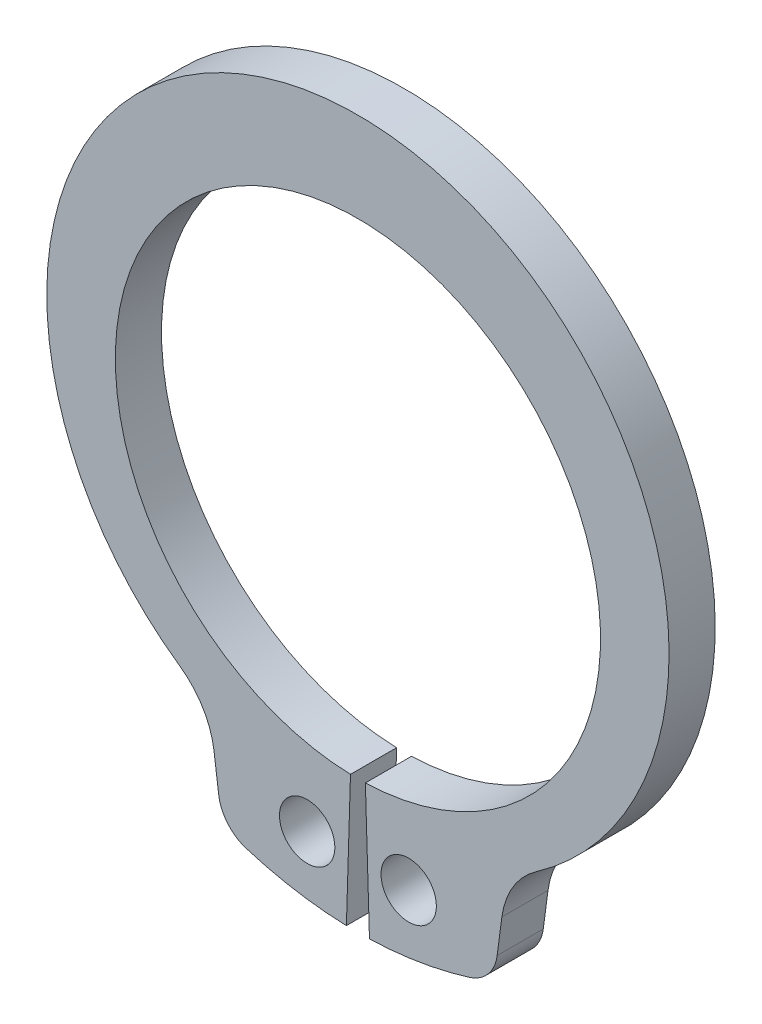
ISO-10303-21;
HEADER;
FILE_DESCRIPTION(('STEP AP214'),'2;1');
FILE_NAME('part.step','',(''),(''),'','','');
FILE_SCHEMA(('AUTOMOTIVE_DESIGN { 1 0 10303 214 1 1 1 1 }'));
ENDSEC;
DATA;
#1=APPLICATION_CONTEXT('core data for automotive mechanical design processes');
#2=APPLICATION_PROTOCOL_DEFINITION('international standard','automotive_design',2000,#1);
#3=PRODUCT_CONTEXT('',#1,'mechanical');
#4=PRODUCT('Part','Part','',(#3));
#5=PRODUCT_RELATED_PRODUCT_CATEGORY('part','',(#4));
#6=PRODUCT_DEFINITION_FORMATION('','',#4);
#7=PRODUCT_DEFINITION_CONTEXT('part definition',#1,'design');
#8=PRODUCT_DEFINITION('design','',#6,#7);
#9=PRODUCT_DEFINITION_SHAPE('','',#8);
#10=(LENGTH_UNIT() NAMED_UNIT(*) SI_UNIT(.MILLI.,.METRE.));
#11=(NAMED_UNIT(*) PLANE_ANGLE_UNIT() SI_UNIT($,.RADIAN.));
#12=(NAMED_UNIT(*) SI_UNIT($,.STERADIAN.) SOLID_ANGLE_UNIT());
#13=UNCERTAINTY_MEASURE_WITH_UNIT(LENGTH_MEASURE(1.E-05),#10,'distance_accuracy_value','');
#14=(GEOMETRIC_REPRESENTATION_CONTEXT(3) GLOBAL_UNCERTAINTY_ASSIGNED_CONTEXT((#13)) GLOBAL_UNIT_ASSIGNED_CONTEXT((#10,
#11,#12)) REPRESENTATION_CONTEXT('',''));
#15=CARTESIAN_POINT('',(0.,0.,0.));
#16=DIRECTION('',(0.,0.,1.));
#17=DIRECTION('',(1.,0.,0.));
#18=AXIS2_PLACEMENT_3D('',#15,#16,#17);
#19=CARTESIAN_POINT('',(0.,0.,-0.889));
#20=DIRECTION('',(0.,0.,1.));
#21=DIRECTION('',(1.,0.,0.));
#22=AXIS2_PLACEMENT_3D('',#19,#20,#21);
#23=CYLINDRICAL_SURFACE('',#22,4.6736);
#24=CARTESIAN_POINT('',(0.,0.,0.));
#25=DIRECTION('',(0.,0.,-1.));
#26=DIRECTION('',(1.,0.,0.));
#27=AXIS2_PLACEMENT_3D('',#24,#25,#26);
#28=CIRCLE('',#27,4.6736);
#29=CARTESIAN_POINT('',(-0.143487719298246,-4.67139681834145,0.));
#30=VERTEX_POINT('',#29);
#31=CARTESIAN_POINT('',(0.143487719298246,-4.67139681834145,0.));
#32=VERTEX_POINT('',#31);
#33=EDGE_CURVE('E153',#30,#32,#28,.T.);
#34=ORIENTED_EDGE('',*,*,#33,.F.);
#35=DIRECTION('',(0.,0.,1.));
#36=VECTOR('',#35,1.);
#37=CARTESIAN_POINT('',(-0.143487719298246,-4.67139681834145,-0.889));
#38=LINE('',#37,#36);
#39=CARTESIAN_POINT('',(-0.143487719298246,-4.67139681834145,-0.889));
#40=VERTEX_POINT('',#39);
#41=EDGE_CURVE('E11',#40,#30,#38,.T.);
#42=ORIENTED_EDGE('',*,*,#41,.F.);
#43=CARTESIAN_POINT('',(0.,0.,-0.889));
#44=DIRECTION('',(0.,0.,-1.));
#45=DIRECTION('',(1.,0.,0.));
#46=AXIS2_PLACEMENT_3D('',#43,#44,#45);
#47=CIRCLE('',#46,4.6736);
#48=CARTESIAN_POINT('',(0.143487719298246,-4.67139681834145,-0.889));
#49=VERTEX_POINT('',#48);
#50=EDGE_CURVE('E186',#40,#49,#47,.T.);
#51=ORIENTED_EDGE('',*,*,#50,.T.);
#52=DIRECTION('',(0.,0.,1.));
#53=VECTOR('',#52,1.);
#54=CARTESIAN_POINT('',(0.143487719298246,-4.67139681834145,-0.889));
#55=LINE('',#54,#53);
#56=EDGE_CURVE('E35',#49,#32,#55,.T.);
#57=ORIENTED_EDGE('',*,*,#56,.T.);
#58=EDGE_LOOP('',(#34,#42,#51,#57));
#59=FACE_BOUND('',#58,.T.);
#60=ADVANCED_FACE('F32',(#59),#23,.F.);
#61=CARTESIAN_POINT('',(-0.143487719298246,-4.67139681834145,-0.889));
#62=DIRECTION('',(0.99952859002513,-0.0307017543859649,0.));
#63=DIRECTION('',(0.0307017543859649,0.99952859002513,0.));
#64=AXIS2_PLACEMENT_3D('',#61,#62,#63);
#65=PLANE('',#64);
#66=DIRECTION('',(0.0307017543859649,0.99952859002513,0.));
#67=VECTOR('',#66,1.);
#68=CARTESIAN_POINT('',(-0.143487719298246,-4.67139681834145,0.));
#69=LINE('',#68,#67);
#70=CARTESIAN_POINT('',(-0.22225,-7.23558746319192,0.));
#71=VERTEX_POINT('',#70);
#72=EDGE_CURVE('E184',#71,#30,#69,.T.);
#73=ORIENTED_EDGE('',*,*,#72,.F.);
#74=DIRECTION('',(0.,0.,1.));
#75=VECTOR('',#74,1.);
#76=CARTESIAN_POINT('',(-0.22225,-7.23558746319192,-0.889));
#77=LINE('',#76,#75);
#78=CARTESIAN_POINT('',(-0.22225,-7.23558746319192,-0.889));
#79=VERTEX_POINT('',#78);
#80=EDGE_CURVE('E41',#79,#71,#77,.T.);
#81=ORIENTED_EDGE('',*,*,#80,.F.);
#82=DIRECTION('',(0.0307017543859649,0.99952859002513,0.));
#83=VECTOR('',#82,1.);
#84=CARTESIAN_POINT('',(-0.143487719298246,-4.67139681834145,-0.889));
#85=LINE('',#84,#83);
#86=EDGE_CURVE('E143',#79,#40,#85,.T.);
#87=ORIENTED_EDGE('',*,*,#86,.T.);
#88=ORIENTED_EDGE('',*,*,#41,.T.);
#89=EDGE_LOOP('',(#73,#81,#87,#88));
#90=FACE_BOUND('',#89,.T.);
#91=ADVANCED_FACE('F206',(#90),#65,.T.);
#92=CARTESIAN_POINT('',(0.,0.,-0.889));
#93=DIRECTION('',(0.,0.,1.));
#94=DIRECTION('',(1.,0.,0.));
#95=AXIS2_PLACEMENT_3D('',#92,#93,#94);
#96=CYLINDRICAL_SURFACE('',#95,7.239);
#97=CARTESIAN_POINT('',(0.,0.,0.));
#98=DIRECTION('',(0.,0.,1.));
#99=DIRECTION('',(1.,0.,0.));
#100=AXIS2_PLACEMENT_3D('',#97,#98,#99);
#101=CIRCLE('',#100,7.239);
#102=CARTESIAN_POINT('',(-2.15332023130108,-6.91131919256154,0.));
#103=VERTEX_POINT('',#102);
#104=EDGE_CURVE('E130',#103,#71,#101,.T.);
#105=ORIENTED_EDGE('',*,*,#104,.F.);
#106=DIRECTION('',(0.,0.,1.));
#107=VECTOR('',#106,1.);
#108=CARTESIAN_POINT('',(-2.15332023130108,-6.91131919256154,-0.889));
#109=LINE('',#108,#107);
#110=CARTESIAN_POINT('',(-2.15332023130108,-6.91131919256154,-0.889));
#111=VERTEX_POINT('',#110);
#112=EDGE_CURVE('E125',#111,#103,#109,.T.);
#113=ORIENTED_EDGE('',*,*,#112,.F.);
#114=CARTESIAN_POINT('',(0.,0.,-0.889));
#115=DIRECTION('',(0.,0.,1.));
#116=DIRECTION('',(1.,0.,0.));
#117=AXIS2_PLACEMENT_3D('',#114,#115,#116);
#118=CIRCLE('',#117,7.239);
#119=EDGE_CURVE('E128',#111,#79,#118,.T.);
#120=ORIENTED_EDGE('',*,*,#119,.T.);
#121=ORIENTED_EDGE('',*,*,#80,.T.);
#122=EDGE_LOOP('',(#105,#113,#120,#121));
#123=FACE_BOUND('',#122,.T.);
#124=ADVANCED_FACE('F127',(#123),#96,.T.);
#125=CARTESIAN_POINT('',(-1.9266549437957,-6.18381190913401,-0.889));
#126=DIRECTION('',(0.,0.,1.));
#127=DIRECTION('',(1.,0.,0.));
#128=AXIS2_PLACEMENT_3D('',#125,#126,#127);
#129=CYLINDRICAL_SURFACE('',#128,0.762000000000001);
#130=CARTESIAN_POINT('',(-1.9266549437957,-6.18381190913401,0.));
#131=DIRECTION('',(0.,0.,1.));
#132=DIRECTION('',(1.,0.,0.));
#133=AXIS2_PLACEMENT_3D('',#130,#131,#132);
#134=CIRCLE('',#133,0.762000000000001);
#135=CARTESIAN_POINT('',(-2.68213592816255,-6.28327286760569,0.));
#136=VERTEX_POINT('',#135);
#137=EDGE_CURVE('E181',#136,#103,#134,.T.);
#138=ORIENTED_EDGE('',*,*,#137,.F.);
#139=DIRECTION('',(0.,0.,1.));
#140=VECTOR('',#139,1.);
#141=CARTESIAN_POINT('',(-2.68213592816255,-6.28327286760569,-0.889));
#142=LINE('',#141,#140);
#143=CARTESIAN_POINT('',(-2.68213592816255,-6.28327286760569,-0.889));
#144=VERTEX_POINT('',#143);
#145=EDGE_CURVE('E135',#144,#136,#142,.T.);
#146=ORIENTED_EDGE('',*,*,#145,.F.);
#147=CARTESIAN_POINT('',(-1.9266549437957,-6.18381190913401,-0.889));
#148=DIRECTION('',(0.,0.,1.));
#149=DIRECTION('',(1.,0.,0.));
#150=AXIS2_PLACEMENT_3D('',#147,#148,#149);
#151=CIRCLE('',#150,0.762000000000001);
#152=EDGE_CURVE('E141',#144,#111,#151,.T.);
#153=ORIENTED_EDGE('',*,*,#152,.T.);
#154=ORIENTED_EDGE('',*,*,#112,.T.);
#155=EDGE_LOOP('',(#138,#146,#153,#154));
#156=FACE_BOUND('',#155,.T.);
#157=ADVANCED_FACE('F145',(#156),#129,.T.);
#158=CARTESIAN_POINT('',(-2.77296439711652,-5.593362150996,-0.889));
#159=DIRECTION('',(-0.99144486137381,-0.130526192220053,0.));
#160=DIRECTION('',(0.130526192220053,-0.99144486137381,0.));
#161=AXIS2_PLACEMENT_3D('',#158,#159,#160);
#162=PLANE('',#161);
#163=DIRECTION('',(0.130526192220053,-0.99144486137381,0.));
#164=VECTOR('',#163,1.);
#165=CARTESIAN_POINT('',(-2.77296439711652,-5.593362150996,0.));
#166=LINE('',#165,#164);
#167=CARTESIAN_POINT('',(-2.77296439711652,-5.593362150996,0.));
#168=VERTEX_POINT('',#167);
#169=EDGE_CURVE('E178',#168,#136,#166,.T.);
#170=ORIENTED_EDGE('',*,*,#169,.F.);
#171=DIRECTION('',(0.,0.,1.));
#172=VECTOR('',#171,1.);
#173=CARTESIAN_POINT('',(-2.77296439711652,-5.593362150996,-0.889));
#174=LINE('',#173,#172);
#175=CARTESIAN_POINT('',(-2.77296439711652,-5.593362150996,-0.889));
#176=VERTEX_POINT('',#175);
#177=EDGE_CURVE('E190',#176,#168,#174,.T.);
#178=ORIENTED_EDGE('',*,*,#177,.F.);
#179=DIRECTION('',(0.130526192220053,-0.99144486137381,0.));
#180=VECTOR('',#179,1.);
#181=CARTESIAN_POINT('',(-2.77296439711652,-5.593362150996,-0.889));
#182=LINE('',#181,#180);
#183=EDGE_CURVE('E146',#176,#144,#182,.T.);
#184=ORIENTED_EDGE('',*,*,#183,.T.);
#185=ORIENTED_EDGE('',*,*,#145,.T.);
#186=EDGE_LOOP('',(#170,#178,#184,#185));
#187=FACE_BOUND('',#186,.T.);
#188=ADVANCED_FACE('F219',(#187),#162,.T.);
#189=CARTESIAN_POINT('',(-4.33327386174191,-5.79878078902319,-0.889));
#190=DIRECTION('',(0.,0.,1.));
#191=DIRECTION('',(1.,0.,0.));
#192=AXIS2_PLACEMENT_3D('',#189,#190,#191);
#193=CYLINDRICAL_SURFACE('',#192,1.57377331348848);
#194=CARTESIAN_POINT('',(-4.33327386174191,-5.79878078902319,0.));
#195=DIRECTION('',(0.,0.,-1.));
#196=DIRECTION('',(1.,0.,0.));
#197=AXIS2_PLACEMENT_3D('',#194,#195,#196);
#198=CIRCLE('',#197,1.57377331348848);
#199=CARTESIAN_POINT('',(-3.43220429590088,-4.50849551833164,0.));
#200=VERTEX_POINT('',#199);
#201=EDGE_CURVE('E175',#200,#168,#198,.T.);
#202=ORIENTED_EDGE('',*,*,#201,.F.);
#203=DIRECTION('',(0.,0.,1.));
#204=VECTOR('',#203,1.);
#205=CARTESIAN_POINT('',(-3.43220429590088,-4.50849551833164,-0.889));
#206=LINE('',#205,#204);
#207=CARTESIAN_POINT('',(-3.43220429590088,-4.50849551833164,-0.889));
#208=VERTEX_POINT('',#207);
#209=EDGE_CURVE('E192',#208,#200,#206,.T.);
#210=ORIENTED_EDGE('',*,*,#209,.F.);
#211=CARTESIAN_POINT('',(-4.33327386174191,-5.79878078902319,-0.889));
#212=DIRECTION('',(0.,0.,-1.));
#213=DIRECTION('',(1.,0.,0.));
#214=AXIS2_PLACEMENT_3D('',#211,#212,#213);
#215=CIRCLE('',#214,1.57377331348848);
#216=EDGE_CURVE('E148',#208,#176,#215,.T.);
#217=ORIENTED_EDGE('',*,*,#216,.T.);
#218=ORIENTED_EDGE('',*,*,#177,.T.);
#219=EDGE_LOOP('',(#202,#210,#217,#218));
#220=FACE_BOUND('',#219,.T.);
#221=ADVANCED_FACE('F222',(#220),#193,.F.);
#222=CARTESIAN_POINT('',(0.,0.406244493857957,-0.889));
#223=DIRECTION('',(0.,0.,1.));
#224=DIRECTION('',(1.,0.,0.));
#225=AXIS2_PLACEMENT_3D('',#222,#223,#224);
#226=CYLINDRICAL_SURFACE('',#225,5.99455550614204);
#227=CARTESIAN_POINT('',(0.,0.406244493857957,0.));
#228=DIRECTION('',(0.,0.,1.));
#229=DIRECTION('',(1.,0.,0.));
#230=AXIS2_PLACEMENT_3D('',#227,#228,#229);
#231=CIRCLE('',#230,5.99455550614204);
#232=CARTESIAN_POINT('',(3.43220429590088,-4.50849551833164,0.));
#233=VERTEX_POINT('',#232);
#234=EDGE_CURVE('E172',#233,#200,#231,.T.);
#235=ORIENTED_EDGE('',*,*,#234,.F.);
#236=DIRECTION('',(0.,0.,1.));
#237=VECTOR('',#236,1.);
#238=CARTESIAN_POINT('',(3.43220429590088,-4.50849551833164,-0.889));
#239=LINE('',#238,#237);
#240=CARTESIAN_POINT('',(3.43220429590088,-4.50849551833164,-0.889));
#241=VERTEX_POINT('',#240);
#242=EDGE_CURVE('E194',#241,#233,#239,.T.);
#243=ORIENTED_EDGE('',*,*,#242,.F.);
#244=CARTESIAN_POINT('',(0.,0.406244493857957,-0.889));
#245=DIRECTION('',(0.,0.,1.));
#246=DIRECTION('',(1.,0.,0.));
#247=AXIS2_PLACEMENT_3D('',#244,#245,#246);
#248=CIRCLE('',#247,5.99455550614204);
#249=EDGE_CURVE('E296',#241,#208,#248,.T.);
#250=ORIENTED_EDGE('',*,*,#249,.T.);
#251=ORIENTED_EDGE('',*,*,#209,.T.);
#252=EDGE_LOOP('',(#235,#243,#250,#251));
#253=FACE_BOUND('',#252,.T.);
#254=ADVANCED_FACE('F226',(#253),#226,.T.);
#255=CARTESIAN_POINT('',(4.33327386174191,-5.79878078902319,-0.889));
#256=DIRECTION('',(0.,0.,1.));
#257=DIRECTION('',(1.,0.,0.));
#258=AXIS2_PLACEMENT_3D('',#255,#256,#257);
#259=CYLINDRICAL_SURFACE('',#258,1.57377331348848);
#260=CARTESIAN_POINT('',(4.33327386174191,-5.79878078902319,0.));
#261=DIRECTION('',(0.,0.,-1.));
#262=DIRECTION('',(1.,0.,0.));
#263=AXIS2_PLACEMENT_3D('',#260,#261,#262);
#264=CIRCLE('',#263,1.57377331348848);
#265=CARTESIAN_POINT('',(2.77296439711652,-5.593362150996,0.));
#266=VERTEX_POINT('',#265);
#267=EDGE_CURVE('E169',#266,#233,#264,.T.);
#268=ORIENTED_EDGE('',*,*,#267,.F.);
#269=DIRECTION('',(0.,0.,1.));
#270=VECTOR('',#269,1.);
#271=CARTESIAN_POINT('',(2.77296439711652,-5.593362150996,-0.889));
#272=LINE('',#271,#270);
#273=CARTESIAN_POINT('',(2.77296439711652,-5.593362150996,-0.889));
#274=VERTEX_POINT('',#273);
#275=EDGE_CURVE('E196',#274,#266,#272,.T.);
#276=ORIENTED_EDGE('',*,*,#275,.F.);
#277=CARTESIAN_POINT('',(4.33327386174191,-5.79878078902319,-0.889));
#278=DIRECTION('',(0.,0.,-1.));
#279=DIRECTION('',(1.,0.,0.));
#280=AXIS2_PLACEMENT_3D('',#277,#278,#279);
#281=CIRCLE('',#280,1.57377331348848);
#282=EDGE_CURVE('E293',#274,#241,#281,.T.);
#283=ORIENTED_EDGE('',*,*,#282,.T.);
#284=ORIENTED_EDGE('',*,*,#242,.T.);
#285=EDGE_LOOP('',(#268,#276,#283,#284));
#286=FACE_BOUND('',#285,.T.);
#287=ADVANCED_FACE('F230',(#286),#259,.F.);
#288=CARTESIAN_POINT('',(2.77296439711652,-5.593362150996,-0.889));
#289=DIRECTION('',(0.99144486137381,-0.130526192220053,0.));
#290=DIRECTION('',(0.130526192220053,0.99144486137381,0.));
#291=AXIS2_PLACEMENT_3D('',#288,#289,#290);
#292=PLANE('',#291);
#293=DIRECTION('',(0.130526192220053,0.99144486137381,0.));
#294=VECTOR('',#293,1.);
#295=CARTESIAN_POINT('',(2.77296439711652,-5.593362150996,0.));
#296=LINE('',#295,#294);
#297=CARTESIAN_POINT('',(2.68213592816255,-6.28327286760569,0.));
#298=VERTEX_POINT('',#297);
#299=EDGE_CURVE('E166',#298,#266,#296,.T.);
#300=ORIENTED_EDGE('',*,*,#299,.F.);
#301=DIRECTION('',(0.,0.,1.));
#302=VECTOR('',#301,1.);
#303=CARTESIAN_POINT('',(2.68213592816255,-6.28327286760569,-0.889));
#304=LINE('',#303,#302);
#305=CARTESIAN_POINT('',(2.68213592816255,-6.28327286760569,-0.889));
#306=VERTEX_POINT('',#305);
#307=EDGE_CURVE('E198',#306,#298,#304,.T.);
#308=ORIENTED_EDGE('',*,*,#307,.F.);
#309=DIRECTION('',(0.130526192220053,0.99144486137381,0.));
#310=VECTOR('',#309,1.);
#311=CARTESIAN_POINT('',(2.77296439711652,-5.593362150996,-0.889));
#312=LINE('',#311,#310);
#313=EDGE_CURVE('E290',#306,#274,#312,.T.);
#314=ORIENTED_EDGE('',*,*,#313,.T.);
#315=ORIENTED_EDGE('',*,*,#275,.T.);
#316=EDGE_LOOP('',(#300,#308,#314,#315));
#317=FACE_BOUND('',#316,.T.);
#318=ADVANCED_FACE('F234',(#317),#292,.T.);
#319=CARTESIAN_POINT('',(1.9266549437957,-6.18381190913401,-0.889));
#320=DIRECTION('',(0.,0.,1.));
#321=DIRECTION('',(1.,0.,0.));
#322=AXIS2_PLACEMENT_3D('',#319,#320,#321);
#323=CYLINDRICAL_SURFACE('',#322,0.762000000000001);
#324=CARTESIAN_POINT('',(1.9266549437957,-6.18381190913401,0.));
#325=DIRECTION('',(0.,0.,1.));
#326=DIRECTION('',(-1.,0.,0.));
#327=AXIS2_PLACEMENT_3D('',#324,#325,#326);
#328=CIRCLE('',#327,0.762000000000001);
#329=CARTESIAN_POINT('',(2.15332023130108,-6.91131919256154,0.));
#330=VERTEX_POINT('',#329);
#331=EDGE_CURVE('E163',#330,#298,#328,.T.);
#332=ORIENTED_EDGE('',*,*,#331,.F.);
#333=DIRECTION('',(0.,0.,1.));
#334=VECTOR('',#333,1.);
#335=CARTESIAN_POINT('',(2.15332023130108,-6.91131919256154,-0.889));
#336=LINE('',#335,#334);
#337=CARTESIAN_POINT('',(2.15332023130108,-6.91131919256154,-0.889));
#338=VERTEX_POINT('',#337);
#339=EDGE_CURVE('E200',#338,#330,#336,.T.);
#340=ORIENTED_EDGE('',*,*,#339,.F.);
#341=CARTESIAN_POINT('',(1.9266549437957,-6.18381190913401,-0.889));
#342=DIRECTION('',(0.,0.,1.));
#343=DIRECTION('',(-1.,0.,0.));
#344=AXIS2_PLACEMENT_3D('',#341,#342,#343);
#345=CIRCLE('',#344,0.762000000000001);
#346=EDGE_CURVE('E287',#338,#306,#345,.T.);
#347=ORIENTED_EDGE('',*,*,#346,.T.);
#348=ORIENTED_EDGE('',*,*,#307,.T.);
#349=EDGE_LOOP('',(#332,#340,#347,#348));
#350=FACE_BOUND('',#349,.T.);
#351=ADVANCED_FACE('F238',(#350),#323,.T.);
#352=CARTESIAN_POINT('',(0.,0.,-0.889));
#353=DIRECTION('',(0.,0.,1.));
#354=DIRECTION('',(1.,0.,0.));
#355=AXIS2_PLACEMENT_3D('',#352,#353,#354);
#356=CYLINDRICAL_SURFACE('',#355,7.239);
#357=CARTESIAN_POINT('',(0.,0.,0.));
#358=DIRECTION('',(0.,0.,1.));
#359=DIRECTION('',(1.,0.,0.));
#360=AXIS2_PLACEMENT_3D('',#357,#358,#359);
#361=CIRCLE('',#360,7.239);
#362=CARTESIAN_POINT('',(0.222249999999995,-7.23558746319192,0.));
#363=VERTEX_POINT('',#362);
#364=EDGE_CURVE('E160',#363,#330,#361,.T.);
#365=ORIENTED_EDGE('',*,*,#364,.F.);
#366=DIRECTION('',(0.,0.,1.));
#367=VECTOR('',#366,1.);
#368=CARTESIAN_POINT('',(0.222249999999995,-7.23558746319192,-0.889));
#369=LINE('',#368,#367);
#370=CARTESIAN_POINT('',(0.222249999999995,-7.23558746319192,-0.889));
#371=VERTEX_POINT('',#370);
#372=EDGE_CURVE('E201',#371,#363,#369,.T.);
#373=ORIENTED_EDGE('',*,*,#372,.F.);
#374=CARTESIAN_POINT('',(0.,0.,-0.889));
#375=DIRECTION('',(0.,0.,1.));
#376=DIRECTION('',(1.,0.,0.));
#377=AXIS2_PLACEMENT_3D('',#374,#375,#376);
#378=CIRCLE('',#377,7.239);
#379=EDGE_CURVE('E284',#371,#338,#378,.T.);
#380=ORIENTED_EDGE('',*,*,#379,.T.);
#381=ORIENTED_EDGE('',*,*,#339,.T.);
#382=EDGE_LOOP('',(#365,#373,#380,#381));
#383=FACE_BOUND('',#382,.T.);
#384=ADVANCED_FACE('F242',(#383),#356,.T.);
#385=CARTESIAN_POINT('',(0.143487719298246,-4.67139681834145,-0.889));
#386=DIRECTION('',(-0.99952859002513,-0.0307017543859649,0.));
#387=DIRECTION('',(0.0307017543859649,-0.99952859002513,0.));
#388=AXIS2_PLACEMENT_3D('',#385,#386,#387);
#389=PLANE('',#388);
#390=DIRECTION('',(0.0307017543859649,-0.99952859002513,0.));
#391=VECTOR('',#390,1.);
#392=CARTESIAN_POINT('',(0.143487719298246,-4.67139681834145,0.));
#393=LINE('',#392,#391);
#394=EDGE_CURVE('E156',#32,#363,#393,.T.);
#395=ORIENTED_EDGE('',*,*,#394,.F.);
#396=ORIENTED_EDGE('',*,*,#56,.F.);
#397=DIRECTION('',(0.0307017543859649,-0.99952859002513,0.));
#398=VECTOR('',#397,1.);
#399=CARTESIAN_POINT('',(0.143487719298246,-4.67139681834145,-0.889));
#400=LINE('',#399,#398);
#401=EDGE_CURVE('E282',#49,#371,#400,.T.);
#402=ORIENTED_EDGE('',*,*,#401,.T.);
#403=ORIENTED_EDGE('',*,*,#372,.T.);
#404=EDGE_LOOP('',(#395,#396,#402,#403));
#405=FACE_BOUND('',#404,.T.);
#406=ADVANCED_FACE('F203',(#405),#389,.T.);
#407=CARTESIAN_POINT('',(0.,0.,-0.889));
#408=DIRECTION('',(0.,0.,1.));
#409=DIRECTION('',(1.,0.,0.));
#410=AXIS2_PLACEMENT_3D('',#407,#408,#409);
#411=PLANE('',#410);
#412=CARTESIAN_POINT('',(-0.9779,-6.04278491674162,-0.889));
#413=DIRECTION('',(0.,0.,1.));
#414=DIRECTION('',(1.,0.,0.));
#415=AXIS2_PLACEMENT_3D('',#412,#413,#414);
#416=CIRCLE('',#415,0.5334);
#417=CARTESIAN_POINT('',(-0.4445,-6.04278491674162,-0.889));
#418=VERTEX_POINT('',#417);
#419=EDGE_CURVE('E269',#418,#418,#416,.T.);
#420=ORIENTED_EDGE('',*,*,#419,.T.);
#421=EDGE_LOOP('',(#420));
#422=FACE_BOUND('',#421,.T.);
#423=CARTESIAN_POINT('',(0.9779,-6.04278491674162,-0.889));
#424=DIRECTION('',(0.,0.,1.));
#425=DIRECTION('',(1.,0.,0.));
#426=AXIS2_PLACEMENT_3D('',#423,#424,#425);
#427=CIRCLE('',#426,0.5334);
#428=CARTESIAN_POINT('',(1.5113,-6.04278491674162,-0.889));
#429=VERTEX_POINT('',#428);
#430=EDGE_CURVE('E157',#429,#429,#427,.T.);
#431=ORIENTED_EDGE('',*,*,#430,.T.);
#432=EDGE_LOOP('',(#431));
#433=FACE_BOUND('',#432,.T.);
#434=ORIENTED_EDGE('',*,*,#50,.F.);
#435=ORIENTED_EDGE('',*,*,#86,.F.);
#436=ORIENTED_EDGE('',*,*,#119,.F.);
#437=ORIENTED_EDGE('',*,*,#152,.F.);
#438=ORIENTED_EDGE('',*,*,#183,.F.);
#439=ORIENTED_EDGE('',*,*,#216,.F.);
#440=ORIENTED_EDGE('',*,*,#249,.F.);
#441=ORIENTED_EDGE('',*,*,#282,.F.);
#442=ORIENTED_EDGE('',*,*,#313,.F.);
#443=ORIENTED_EDGE('',*,*,#346,.F.);
#444=ORIENTED_EDGE('',*,*,#379,.F.);
#445=ORIENTED_EDGE('',*,*,#401,.F.);
#446=EDGE_LOOP('',(#434,#435,#436,#437,#438,#439,#440,#441,#442,#443,#444,#445));
#447=FACE_BOUND('',#446,.T.);
#448=ADVANCED_FACE('F139',(#422,#433,#447),#411,.F.);
#449=CARTESIAN_POINT('',(0.,0.,0.));
#450=DIRECTION('',(0.,0.,1.));
#451=DIRECTION('',(1.,0.,0.));
#452=AXIS2_PLACEMENT_3D('',#449,#450,#451);
#453=PLANE('',#452);
#454=CARTESIAN_POINT('',(-0.9779,-6.04278491674162,0.));
#455=DIRECTION('',(0.,0.,1.));
#456=DIRECTION('',(1.,0.,0.));
#457=AXIS2_PLACEMENT_3D('',#454,#455,#456);
#458=CIRCLE('',#457,0.5334);
#459=CARTESIAN_POINT('',(-0.4445,-6.04278491674162,0.));
#460=VERTEX_POINT('',#459);
#461=EDGE_CURVE('E272',#460,#460,#458,.T.);
#462=ORIENTED_EDGE('',*,*,#461,.F.);
#463=EDGE_LOOP('',(#462));
#464=FACE_BOUND('',#463,.T.);
#465=CARTESIAN_POINT('',(0.9779,-6.04278491674162,0.));
#466=DIRECTION('',(0.,0.,1.));
#467=DIRECTION('',(1.,0.,0.));
#468=AXIS2_PLACEMENT_3D('',#465,#466,#467);
#469=CIRCLE('',#468,0.5334);
#470=CARTESIAN_POINT('',(1.5113,-6.04278491674162,0.));
#471=VERTEX_POINT('',#470);
#472=EDGE_CURVE('E274',#471,#471,#469,.T.);
#473=ORIENTED_EDGE('',*,*,#472,.F.);
#474=EDGE_LOOP('',(#473));
#475=FACE_BOUND('',#474,.T.);
#476=ORIENTED_EDGE('',*,*,#33,.T.);
#477=ORIENTED_EDGE('',*,*,#394,.T.);
#478=ORIENTED_EDGE('',*,*,#364,.T.);
#479=ORIENTED_EDGE('',*,*,#331,.T.);
#480=ORIENTED_EDGE('',*,*,#299,.T.);
#481=ORIENTED_EDGE('',*,*,#267,.T.);
#482=ORIENTED_EDGE('',*,*,#234,.T.);
#483=ORIENTED_EDGE('',*,*,#201,.T.);
#484=ORIENTED_EDGE('',*,*,#169,.T.);
#485=ORIENTED_EDGE('',*,*,#137,.T.);
#486=ORIENTED_EDGE('',*,*,#104,.T.);
#487=ORIENTED_EDGE('',*,*,#72,.T.);
#488=EDGE_LOOP('',(#476,#477,#478,#479,#480,#481,#482,#483,#484,#485,#486,#487));
#489=FACE_BOUND('',#488,.T.);
#490=ADVANCED_FACE('F205',(#464,#475,#489),#453,.T.);
#491=CARTESIAN_POINT('',(0.9779,-6.04278491674162,-0.889));
#492=DIRECTION('',(0.,0.,1.));
#493=DIRECTION('',(1.,0.,0.));
#494=AXIS2_PLACEMENT_3D('',#491,#492,#493);
#495=CYLINDRICAL_SURFACE('',#494,0.5334);
#496=ORIENTED_EDGE('',*,*,#430,.F.);
#497=EDGE_LOOP('',(#496));
#498=FACE_BOUND('',#497,.T.);
#499=ORIENTED_EDGE('',*,*,#472,.T.);
#500=EDGE_LOOP('',(#499));
#501=FACE_BOUND('',#500,.T.);
#502=ADVANCED_FACE('F254',(#498,#501),#495,.F.);
#503=CARTESIAN_POINT('',(-0.9779,-6.04278491674162,-0.889));
#504=DIRECTION('',(0.,0.,1.));
#505=DIRECTION('',(1.,0.,0.));
#506=AXIS2_PLACEMENT_3D('',#503,#504,#505);
#507=CYLINDRICAL_SURFACE('',#506,0.5334);
#508=ORIENTED_EDGE('',*,*,#419,.F.);
#509=EDGE_LOOP('',(#508));
#510=FACE_BOUND('',#509,.T.);
#511=ORIENTED_EDGE('',*,*,#461,.T.);
#512=EDGE_LOOP('',(#511));
#513=FACE_BOUND('',#512,.T.);
#514=ADVANCED_FACE('F261',(#510,#513),#507,.F.);
#515=CLOSED_SHELL('',(#60,#91,#124,#157,#188,#221,#254,#287,#318,#351,#384,#406,#448,#490,#502,#514));
#516=MANIFOLD_SOLID_BREP('B2',#515);
#517=ADVANCED_BREP_SHAPE_REPRESENTATION('',(#18,#516),#14);
#518=SHAPE_DEFINITION_REPRESENTATION(#9,#517);
ENDSEC;
END-ISO-10303-21;
